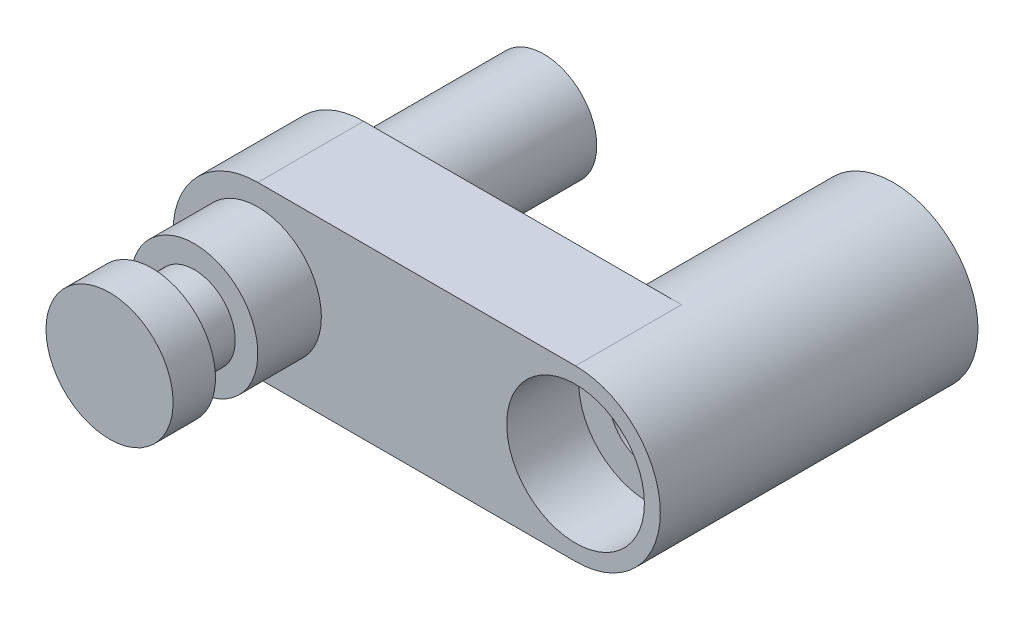
ISO-10303-21;
HEADER;
FILE_DESCRIPTION(('STEP AP214'),'2;1');
FILE_NAME('part.step','',(''),(''),'','','');
FILE_SCHEMA(('AUTOMOTIVE_DESIGN { 1 0 10303 214 1 1 1 1 }'));
ENDSEC;
DATA;
#1=APPLICATION_CONTEXT('core data for automotive mechanical design processes');
#2=APPLICATION_PROTOCOL_DEFINITION('international standard','automotive_design',2000,#1);
#3=PRODUCT_CONTEXT('',#1,'mechanical');
#4=PRODUCT('Part','Part','',(#3));
#5=PRODUCT_RELATED_PRODUCT_CATEGORY('part','',(#4));
#6=PRODUCT_DEFINITION_FORMATION('','',#4);
#7=PRODUCT_DEFINITION_CONTEXT('part definition',#1,'design');
#8=PRODUCT_DEFINITION('design','',#6,#7);
#9=PRODUCT_DEFINITION_SHAPE('','',#8);
#10=(LENGTH_UNIT() NAMED_UNIT(*) SI_UNIT(.MILLI.,.METRE.));
#11=(NAMED_UNIT(*) PLANE_ANGLE_UNIT() SI_UNIT($,.RADIAN.));
#12=(NAMED_UNIT(*) SI_UNIT($,.STERADIAN.) SOLID_ANGLE_UNIT());
#13=UNCERTAINTY_MEASURE_WITH_UNIT(LENGTH_MEASURE(1.E-05),#10,'distance_accuracy_value','');
#14=(GEOMETRIC_REPRESENTATION_CONTEXT(3) GLOBAL_UNCERTAINTY_ASSIGNED_CONTEXT((#13)) GLOBAL_UNIT_ASSIGNED_CONTEXT((#10,
#11,#12)) REPRESENTATION_CONTEXT('',''));
#15=CARTESIAN_POINT('',(0.,0.,0.));
#16=DIRECTION('',(0.,0.,1.));
#17=DIRECTION('',(1.,0.,0.));
#18=AXIS2_PLACEMENT_3D('',#15,#16,#17);
#19=CARTESIAN_POINT('',(0.,0.,10.));
#20=DIRECTION('',(0.,0.,-1.));
#21=DIRECTION('',(-1.,0.,0.));
#22=AXIS2_PLACEMENT_3D('',#19,#20,#21);
#23=CYLINDRICAL_SURFACE('',#22,4.);
#24=CARTESIAN_POINT('',(0.,0.,10.));
#25=DIRECTION('',(0.,0.,1.));
#26=DIRECTION('',(1.,0.,0.));
#27=AXIS2_PLACEMENT_3D('',#24,#25,#26);
#28=CIRCLE('',#27,4.);
#29=CARTESIAN_POINT('',(0.,4.,10.));
#30=VERTEX_POINT('',#29);
#31=CARTESIAN_POINT('',(0.,-4.,10.));
#32=VERTEX_POINT('',#31);
#33=EDGE_CURVE('E48',#30,#32,#28,.T.);
#34=ORIENTED_EDGE('',*,*,#33,.F.);
#35=DIRECTION('',(0.,0.,-1.));
#36=VECTOR('',#35,1.);
#37=CARTESIAN_POINT('',(0.,4.,15.));
#38=LINE('',#37,#36);
#39=CARTESIAN_POINT('',(0.,4.,15.));
#40=VERTEX_POINT('',#39);
#41=EDGE_CURVE('E96',#40,#30,#38,.T.);
#42=ORIENTED_EDGE('',*,*,#41,.F.);
#43=CARTESIAN_POINT('',(0.,0.,15.));
#44=DIRECTION('',(0.,0.,1.));
#45=DIRECTION('',(1.,0.,0.));
#46=AXIS2_PLACEMENT_3D('',#43,#44,#45);
#47=CIRCLE('',#46,4.);
#48=CARTESIAN_POINT('',(0.,-4.,15.));
#49=VERTEX_POINT('',#48);
#50=EDGE_CURVE('E84',#49,#40,#47,.T.);
#51=ORIENTED_EDGE('',*,*,#50,.F.);
#52=DIRECTION('',(0.,0.,-1.));
#53=VECTOR('',#52,1.);
#54=CARTESIAN_POINT('',(0.,-4.,15.));
#55=LINE('',#54,#53);
#56=EDGE_CURVE('E109',#49,#32,#55,.T.);
#57=ORIENTED_EDGE('',*,*,#56,.T.);
#58=EDGE_LOOP('',(#34,#42,#51,#57));
#59=FACE_BOUND('',#58,.T.);
#60=CARTESIAN_POINT('',(0.,0.,0.));
#61=DIRECTION('',(0.,0.,1.));
#62=DIRECTION('',(1.,0.,0.));
#63=AXIS2_PLACEMENT_3D('',#60,#61,#62);
#64=CIRCLE('',#63,4.);
#65=CARTESIAN_POINT('',(4.,0.,0.));
#66=VERTEX_POINT('',#65);
#67=EDGE_CURVE('E118',#66,#66,#64,.T.);
#68=ORIENTED_EDGE('',*,*,#67,.T.);
#69=EDGE_LOOP('',(#68));
#70=FACE_BOUND('',#69,.T.);
#71=ADVANCED_FACE('F41',(#59,#70),#23,.T.);
#72=CARTESIAN_POINT('',(0.,0.,0.));
#73=DIRECTION('',(0.,0.,1.));
#74=DIRECTION('',(1.,0.,0.));
#75=AXIS2_PLACEMENT_3D('',#72,#73,#74);
#76=PLANE('',#75);
#77=CARTESIAN_POINT('',(0.,0.,0.));
#78=DIRECTION('',(0.,0.,1.));
#79=DIRECTION('',(1.,0.,0.));
#80=AXIS2_PLACEMENT_3D('',#77,#78,#79);
#81=CIRCLE('',#80,1.8);
#82=CARTESIAN_POINT('',(1.8,0.,0.));
#83=VERTEX_POINT('',#82);
#84=EDGE_CURVE('E218',#83,#83,#81,.T.);
#85=ORIENTED_EDGE('',*,*,#84,.T.);
#86=EDGE_LOOP('',(#85));
#87=FACE_BOUND('',#86,.T.);
#88=ORIENTED_EDGE('',*,*,#67,.F.);
#89=EDGE_LOOP('',(#88));
#90=FACE_BOUND('',#89,.T.);
#91=ADVANCED_FACE('F123',(#87,#90),#76,.F.);
#92=CARTESIAN_POINT('',(0.,0.,10.));
#93=DIRECTION('',(0.,0.,1.));
#94=DIRECTION('',(1.,0.,0.));
#95=AXIS2_PLACEMENT_3D('',#92,#93,#94);
#96=PLANE('',#95);
#97=CARTESIAN_POINT('',(-15.,0.,10.));
#98=DIRECTION('',(0.,0.,1.));
#99=DIRECTION('',(1.,0.,0.));
#100=AXIS2_PLACEMENT_3D('',#97,#98,#99);
#101=CIRCLE('',#100,2.5);
#102=CARTESIAN_POINT('',(-12.5,0.,10.));
#103=VERTEX_POINT('',#102);
#104=EDGE_CURVE('E220',#103,#103,#101,.T.);
#105=ORIENTED_EDGE('',*,*,#104,.T.);
#106=EDGE_LOOP('',(#105));
#107=FACE_BOUND('',#106,.T.);
#108=DIRECTION('',(1.,0.,0.));
#109=VECTOR('',#108,1.);
#110=CARTESIAN_POINT('',(0.,4.,10.));
#111=LINE('',#110,#109);
#112=CARTESIAN_POINT('',(-15.,4.,10.));
#113=VERTEX_POINT('',#112);
#114=EDGE_CURVE('E95',#113,#30,#111,.T.);
#115=ORIENTED_EDGE('',*,*,#114,.T.);
#116=ORIENTED_EDGE('',*,*,#33,.T.);
#117=DIRECTION('',(1.,0.,0.));
#118=VECTOR('',#117,1.);
#119=CARTESIAN_POINT('',(0.,-4.,10.));
#120=LINE('',#119,#118);
#121=CARTESIAN_POINT('',(-15.,-4.,10.));
#122=VERTEX_POINT('',#121);
#123=EDGE_CURVE('E104',#122,#32,#120,.T.);
#124=ORIENTED_EDGE('',*,*,#123,.F.);
#125=CARTESIAN_POINT('',(-15.,0.,10.));
#126=DIRECTION('',(0.,0.,1.));
#127=DIRECTION('',(1.,0.,0.));
#128=AXIS2_PLACEMENT_3D('',#125,#126,#127);
#129=CIRCLE('',#128,4.);
#130=EDGE_CURVE('E79',#113,#122,#129,.T.);
#131=ORIENTED_EDGE('',*,*,#130,.F.);
#132=EDGE_LOOP('',(#115,#116,#124,#131));
#133=FACE_BOUND('',#132,.T.);
#134=ADVANCED_FACE('F125',(#107,#133),#96,.F.);
#135=CARTESIAN_POINT('',(0.,4.,15.));
#136=DIRECTION('',(0.,1.,0.));
#137=DIRECTION('',(-1.,0.,0.));
#138=AXIS2_PLACEMENT_3D('',#135,#136,#137);
#139=PLANE('',#138);
#140=ORIENTED_EDGE('',*,*,#114,.F.);
#141=DIRECTION('',(0.,0.,-1.));
#142=VECTOR('',#141,1.);
#143=CARTESIAN_POINT('',(-15.,4.,15.));
#144=LINE('',#143,#142);
#145=CARTESIAN_POINT('',(-15.,4.,15.));
#146=VERTEX_POINT('',#145);
#147=EDGE_CURVE('E90',#146,#113,#144,.T.);
#148=ORIENTED_EDGE('',*,*,#147,.F.);
#149=DIRECTION('',(1.,0.,0.));
#150=VECTOR('',#149,1.);
#151=CARTESIAN_POINT('',(0.,4.,15.));
#152=LINE('',#151,#150);
#153=EDGE_CURVE('E94',#146,#40,#152,.T.);
#154=ORIENTED_EDGE('',*,*,#153,.T.);
#155=ORIENTED_EDGE('',*,*,#41,.T.);
#156=EDGE_LOOP('',(#140,#148,#154,#155));
#157=FACE_BOUND('',#156,.T.);
#158=ADVANCED_FACE('F92',(#157),#139,.T.);
#159=CARTESIAN_POINT('',(-15.,0.,15.));
#160=DIRECTION('',(0.,0.,-1.));
#161=DIRECTION('',(-1.,0.,0.));
#162=AXIS2_PLACEMENT_3D('',#159,#160,#161);
#163=CYLINDRICAL_SURFACE('',#162,4.);
#164=ORIENTED_EDGE('',*,*,#130,.T.);
#165=DIRECTION('',(0.,0.,-1.));
#166=VECTOR('',#165,1.);
#167=CARTESIAN_POINT('',(-15.,-4.,15.));
#168=LINE('',#167,#166);
#169=CARTESIAN_POINT('',(-15.,-4.,15.));
#170=VERTEX_POINT('',#169);
#171=EDGE_CURVE('E97',#170,#122,#168,.T.);
#172=ORIENTED_EDGE('',*,*,#171,.F.);
#173=CARTESIAN_POINT('',(-15.,0.,15.));
#174=DIRECTION('',(0.,0.,1.));
#175=DIRECTION('',(1.,0.,0.));
#176=AXIS2_PLACEMENT_3D('',#173,#174,#175);
#177=CIRCLE('',#176,4.);
#178=EDGE_CURVE('E99',#146,#170,#177,.T.);
#179=ORIENTED_EDGE('',*,*,#178,.F.);
#180=ORIENTED_EDGE('',*,*,#147,.T.);
#181=EDGE_LOOP('',(#164,#172,#179,#180));
#182=FACE_BOUND('',#181,.T.);
#183=ADVANCED_FACE('F100',(#182),#163,.T.);
#184=CARTESIAN_POINT('',(0.,-4.,15.));
#185=DIRECTION('',(0.,1.,0.));
#186=DIRECTION('',(-1.,0.,0.));
#187=AXIS2_PLACEMENT_3D('',#184,#185,#186);
#188=PLANE('',#187);
#189=ORIENTED_EDGE('',*,*,#123,.T.);
#190=ORIENTED_EDGE('',*,*,#56,.F.);
#191=DIRECTION('',(1.,0.,0.));
#192=VECTOR('',#191,1.);
#193=CARTESIAN_POINT('',(0.,-4.,15.));
#194=LINE('',#193,#192);
#195=EDGE_CURVE('E63',#170,#49,#194,.T.);
#196=ORIENTED_EDGE('',*,*,#195,.F.);
#197=ORIENTED_EDGE('',*,*,#171,.T.);
#198=EDGE_LOOP('',(#189,#190,#196,#197));
#199=FACE_BOUND('',#198,.T.);
#200=ADVANCED_FACE('F142',(#199),#188,.F.);
#201=CARTESIAN_POINT('',(0.,0.,15.));
#202=DIRECTION('',(0.,0.,1.));
#203=DIRECTION('',(1.,0.,0.));
#204=AXIS2_PLACEMENT_3D('',#201,#202,#203);
#205=PLANE('',#204);
#206=CARTESIAN_POINT('',(-15.,0.,15.));
#207=DIRECTION('',(0.,0.,1.));
#208=DIRECTION('',(1.,0.,0.));
#209=AXIS2_PLACEMENT_3D('',#206,#207,#208);
#210=CIRCLE('',#209,3.);
#211=CARTESIAN_POINT('',(-12.,0.,15.));
#212=VERTEX_POINT('',#211);
#213=EDGE_CURVE('E11',#212,#212,#210,.T.);
#214=ORIENTED_EDGE('',*,*,#213,.F.);
#215=EDGE_LOOP('',(#214));
#216=FACE_BOUND('',#215,.T.);
#217=CARTESIAN_POINT('',(0.,0.,15.));
#218=DIRECTION('',(0.,0.,1.));
#219=DIRECTION('',(1.,0.,0.));
#220=AXIS2_PLACEMENT_3D('',#217,#218,#219);
#221=CIRCLE('',#220,3.25);
#222=CARTESIAN_POINT('',(3.25,0.,15.));
#223=VERTEX_POINT('',#222);
#224=EDGE_CURVE('E209',#223,#223,#221,.T.);
#225=ORIENTED_EDGE('',*,*,#224,.F.);
#226=EDGE_LOOP('',(#225));
#227=FACE_BOUND('',#226,.T.);
#228=ORIENTED_EDGE('',*,*,#50,.T.);
#229=ORIENTED_EDGE('',*,*,#153,.F.);
#230=ORIENTED_EDGE('',*,*,#178,.T.);
#231=ORIENTED_EDGE('',*,*,#195,.T.);
#232=EDGE_LOOP('',(#228,#229,#230,#231));
#233=FACE_BOUND('',#232,.T.);
#234=ADVANCED_FACE('F102',(#216,#227,#233),#205,.T.);
#235=CARTESIAN_POINT('',(-15.,0.,1.5));
#236=DIRECTION('',(0.,0.,1.));
#237=DIRECTION('',(1.,0.,0.));
#238=AXIS2_PLACEMENT_3D('',#235,#236,#237);
#239=CYLINDRICAL_SURFACE('',#238,2.5);
#240=CARTESIAN_POINT('',(-15.,0.,1.5));
#241=DIRECTION('',(0.,0.,1.));
#242=DIRECTION('',(1.,0.,0.));
#243=AXIS2_PLACEMENT_3D('',#240,#241,#242);
#244=CIRCLE('',#243,2.5);
#245=CARTESIAN_POINT('',(-12.5,0.,1.5));
#246=VERTEX_POINT('',#245);
#247=EDGE_CURVE('E111',#246,#246,#244,.T.);
#248=ORIENTED_EDGE('',*,*,#247,.T.);
#249=EDGE_LOOP('',(#248));
#250=FACE_BOUND('',#249,.T.);
#251=ORIENTED_EDGE('',*,*,#104,.F.);
#252=EDGE_LOOP('',(#251));
#253=FACE_BOUND('',#252,.T.);
#254=ADVANCED_FACE('F148',(#250,#253),#239,.T.);
#255=CARTESIAN_POINT('',(0.,0.,1.5));
#256=DIRECTION('',(0.,0.,1.));
#257=DIRECTION('',(1.,0.,0.));
#258=AXIS2_PLACEMENT_3D('',#255,#256,#257);
#259=PLANE('',#258);
#260=ORIENTED_EDGE('',*,*,#247,.F.);
#261=EDGE_LOOP('',(#260));
#262=FACE_BOUND('',#261,.T.);
#263=ADVANCED_FACE('F152',(#262),#259,.F.);
#264=CARTESIAN_POINT('',(0.,0.,15.));
#265=DIRECTION('',(0.,0.,1.));
#266=DIRECTION('',(1.,0.,0.));
#267=AXIS2_PLACEMENT_3D('',#264,#265,#266);
#268=CYLINDRICAL_SURFACE('',#267,1.8);
#269=ORIENTED_EDGE('',*,*,#84,.F.);
#270=EDGE_LOOP('',(#269));
#271=FACE_BOUND('',#270,.T.);
#272=CARTESIAN_POINT('',(0.,0.,11.6));
#273=DIRECTION('',(0.,0.,1.));
#274=DIRECTION('',(1.,0.,0.));
#275=AXIS2_PLACEMENT_3D('',#272,#273,#274);
#276=CIRCLE('',#275,1.8);
#277=CARTESIAN_POINT('',(1.8,0.,11.6));
#278=VERTEX_POINT('',#277);
#279=EDGE_CURVE('E215',#278,#278,#276,.T.);
#280=ORIENTED_EDGE('',*,*,#279,.T.);
#281=EDGE_LOOP('',(#280));
#282=FACE_BOUND('',#281,.T.);
#283=ADVANCED_FACE('F155',(#271,#282),#268,.F.);
#284=CARTESIAN_POINT('',(1.8,0.,11.6));
#285=DIRECTION('',(0.,0.,-1.));
#286=DIRECTION('',(-1.,0.,0.));
#287=AXIS2_PLACEMENT_3D('',#284,#285,#286);
#288=PLANE('',#287);
#289=ORIENTED_EDGE('',*,*,#279,.F.);
#290=EDGE_LOOP('',(#289));
#291=FACE_BOUND('',#290,.T.);
#292=CARTESIAN_POINT('',(0.,0.,11.6));
#293=DIRECTION('',(0.,0.,1.));
#294=DIRECTION('',(1.,0.,0.));
#295=AXIS2_PLACEMENT_3D('',#292,#293,#294);
#296=CIRCLE('',#295,3.25);
#297=CARTESIAN_POINT('',(3.25,0.,11.6));
#298=VERTEX_POINT('',#297);
#299=EDGE_CURVE('E212',#298,#298,#296,.T.);
#300=ORIENTED_EDGE('',*,*,#299,.T.);
#301=EDGE_LOOP('',(#300));
#302=FACE_BOUND('',#301,.T.);
#303=ADVANCED_FACE('F158',(#291,#302),#288,.F.);
#304=CARTESIAN_POINT('',(0.,0.,15.));
#305=DIRECTION('',(0.,0.,1.));
#306=DIRECTION('',(1.,0.,0.));
#307=AXIS2_PLACEMENT_3D('',#304,#305,#306);
#308=CYLINDRICAL_SURFACE('',#307,3.25);
#309=ORIENTED_EDGE('',*,*,#299,.F.);
#310=EDGE_LOOP('',(#309));
#311=FACE_BOUND('',#310,.T.);
#312=ORIENTED_EDGE('',*,*,#224,.T.);
#313=EDGE_LOOP('',(#312));
#314=FACE_BOUND('',#313,.T.);
#315=ADVANCED_FACE('F162',(#311,#314),#308,.F.);
#316=CARTESIAN_POINT('',(-15.,0.,10.));
#317=DIRECTION('',(0.,0.,-1.));
#318=DIRECTION('',(-1.,0.,0.));
#319=AXIS2_PLACEMENT_3D('',#316,#317,#318);
#320=CYLINDRICAL_SURFACE('',#319,3.);
#321=CARTESIAN_POINT('',(-15.,0.,18.));
#322=DIRECTION('',(0.,0.,-1.));
#323=DIRECTION('',(-1.,0.,0.));
#324=AXIS2_PLACEMENT_3D('',#321,#322,#323);
#325=CIRCLE('',#324,3.);
#326=CARTESIAN_POINT('',(-18.,0.,18.));
#327=VERTEX_POINT('',#326);
#328=EDGE_CURVE('E206',#327,#327,#325,.T.);
#329=ORIENTED_EDGE('',*,*,#328,.T.);
#330=EDGE_LOOP('',(#329));
#331=FACE_BOUND('',#330,.T.);
#332=ORIENTED_EDGE('',*,*,#213,.T.);
#333=EDGE_LOOP('',(#332));
#334=FACE_BOUND('',#333,.T.);
#335=ADVANCED_FACE('F166',(#331,#334),#320,.T.);
#336=CARTESIAN_POINT('',(-18.,0.,18.));
#337=DIRECTION('',(0.,0.,1.));
#338=DIRECTION('',(1.,0.,0.));
#339=AXIS2_PLACEMENT_3D('',#336,#337,#338);
#340=PLANE('',#339);
#341=CARTESIAN_POINT('',(-15.,0.,18.));
#342=DIRECTION('',(0.,0.,-1.));
#343=DIRECTION('',(-1.,0.,0.));
#344=AXIS2_PLACEMENT_3D('',#341,#342,#343);
#345=CIRCLE('',#344,1.93479130274218);
#346=CARTESIAN_POINT('',(-16.9347913027422,0.,18.));
#347=VERTEX_POINT('',#346);
#348=EDGE_CURVE('E203',#347,#347,#345,.T.);
#349=ORIENTED_EDGE('',*,*,#348,.T.);
#350=EDGE_LOOP('',(#349));
#351=FACE_BOUND('',#350,.T.);
#352=ORIENTED_EDGE('',*,*,#328,.F.);
#353=EDGE_LOOP('',(#352));
#354=FACE_BOUND('',#353,.T.);
#355=ADVANCED_FACE('F170',(#351,#354),#340,.T.);
#356=CARTESIAN_POINT('',(-15.,0.,10.));
#357=DIRECTION('',(0.,0.,-1.));
#358=DIRECTION('',(-1.,0.,0.));
#359=AXIS2_PLACEMENT_3D('',#356,#357,#358);
#360=CYLINDRICAL_SURFACE('',#359,1.93479130274218);
#361=CARTESIAN_POINT('',(-15.,0.,20.));
#362=DIRECTION('',(0.,0.,-1.));
#363=DIRECTION('',(-1.,0.,0.));
#364=AXIS2_PLACEMENT_3D('',#361,#362,#363);
#365=CIRCLE('',#364,1.93479130274217);
#366=CARTESIAN_POINT('',(-16.9347913027422,0.,20.));
#367=VERTEX_POINT('',#366);
#368=EDGE_CURVE('E198',#367,#367,#365,.T.);
#369=ORIENTED_EDGE('',*,*,#368,.T.);
#370=EDGE_LOOP('',(#369));
#371=FACE_BOUND('',#370,.T.);
#372=ORIENTED_EDGE('',*,*,#348,.F.);
#373=EDGE_LOOP('',(#372));
#374=FACE_BOUND('',#373,.T.);
#375=ADVANCED_FACE('F174',(#371,#374),#360,.T.);
#376=CARTESIAN_POINT('',(-16.9347913027422,0.,20.));
#377=DIRECTION('',(0.,0.,-1.));
#378=DIRECTION('',(-1.,0.,0.));
#379=AXIS2_PLACEMENT_3D('',#376,#377,#378);
#380=PLANE('',#379);
#381=CARTESIAN_POINT('',(-15.,0.,20.));
#382=DIRECTION('',(0.,0.,-1.));
#383=DIRECTION('',(-1.,0.,0.));
#384=AXIS2_PLACEMENT_3D('',#381,#382,#383);
#385=CIRCLE('',#384,3.00000000000001);
#386=CARTESIAN_POINT('',(-18.,0.,20.));
#387=VERTEX_POINT('',#386);
#388=EDGE_CURVE('E195',#387,#387,#385,.T.);
#389=ORIENTED_EDGE('',*,*,#388,.T.);
#390=EDGE_LOOP('',(#389));
#391=FACE_BOUND('',#390,.T.);
#392=ORIENTED_EDGE('',*,*,#368,.F.);
#393=EDGE_LOOP('',(#392));
#394=FACE_BOUND('',#393,.T.);
#395=ADVANCED_FACE('F178',(#391,#394),#380,.T.);
#396=CARTESIAN_POINT('',(-15.,0.,10.));
#397=DIRECTION('',(0.,0.,-1.));
#398=DIRECTION('',(-1.,0.,0.));
#399=AXIS2_PLACEMENT_3D('',#396,#397,#398);
#400=CYLINDRICAL_SURFACE('',#399,3.00000000000001);
#401=CARTESIAN_POINT('',(-15.,0.,22.));
#402=DIRECTION('',(0.,0.,-1.));
#403=DIRECTION('',(-1.,0.,0.));
#404=AXIS2_PLACEMENT_3D('',#401,#402,#403);
#405=CIRCLE('',#404,3.00000000000001);
#406=CARTESIAN_POINT('',(-18.,0.,22.));
#407=VERTEX_POINT('',#406);
#408=EDGE_CURVE('E194',#407,#407,#405,.T.);
#409=ORIENTED_EDGE('',*,*,#408,.T.);
#410=EDGE_LOOP('',(#409));
#411=FACE_BOUND('',#410,.T.);
#412=ORIENTED_EDGE('',*,*,#388,.F.);
#413=EDGE_LOOP('',(#412));
#414=FACE_BOUND('',#413,.T.);
#415=ADVANCED_FACE('F182',(#411,#414),#400,.T.);
#416=CARTESIAN_POINT('',(-18.,0.,22.));
#417=DIRECTION('',(0.,0.,1.));
#418=DIRECTION('',(1.,0.,0.));
#419=AXIS2_PLACEMENT_3D('',#416,#417,#418);
#420=PLANE('',#419);
#421=ORIENTED_EDGE('',*,*,#408,.F.);
#422=EDGE_LOOP('',(#421));
#423=FACE_BOUND('',#422,.T.);
#424=ADVANCED_FACE('F186',(#423),#420,.T.);
#425=CLOSED_SHELL('',(#71,#91,#134,#158,#183,#200,#234,#254,#263,#283,#303,#315,#335,#355,#375,
#395,#415,#424));
#426=MANIFOLD_SOLID_BREP('B2',#425);
#427=ADVANCED_BREP_SHAPE_REPRESENTATION('',(#18,#426),#14);
#428=SHAPE_DEFINITION_REPRESENTATION(#9,#427);
ENDSEC;
END-ISO-10303-21;
